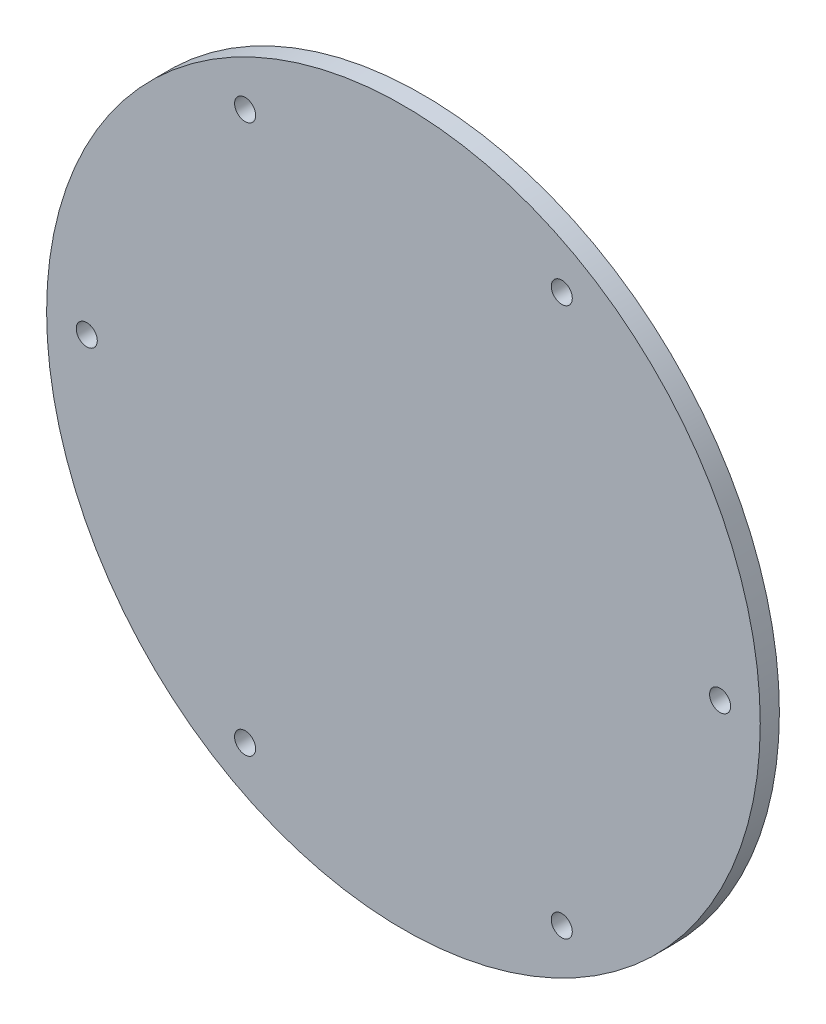
ISO-10303-21;
HEADER;
FILE_DESCRIPTION(('STEP AP214'),'2;1');
FILE_NAME('part.step','',(''),(''),'','','');
FILE_SCHEMA(('AUTOMOTIVE_DESIGN { 1 0 10303 214 1 1 1 1 }'));
ENDSEC;
DATA;
#1=APPLICATION_CONTEXT('core data for automotive mechanical design processes');
#2=APPLICATION_PROTOCOL_DEFINITION('international standard','automotive_design',2000,#1);
#3=PRODUCT_CONTEXT('',#1,'mechanical');
#4=PRODUCT('Part','Part','',(#3));
#5=PRODUCT_RELATED_PRODUCT_CATEGORY('part','',(#4));
#6=PRODUCT_DEFINITION_FORMATION('','',#4);
#7=PRODUCT_DEFINITION_CONTEXT('part definition',#1,'design');
#8=PRODUCT_DEFINITION('design','',#6,#7);
#9=PRODUCT_DEFINITION_SHAPE('','',#8);
#10=(LENGTH_UNIT() NAMED_UNIT(*) SI_UNIT(.MILLI.,.METRE.));
#11=(NAMED_UNIT(*) PLANE_ANGLE_UNIT() SI_UNIT($,.RADIAN.));
#12=(NAMED_UNIT(*) SI_UNIT($,.STERADIAN.) SOLID_ANGLE_UNIT());
#13=UNCERTAINTY_MEASURE_WITH_UNIT(LENGTH_MEASURE(1.E-05),#10,'distance_accuracy_value','');
#14=(GEOMETRIC_REPRESENTATION_CONTEXT(3) GLOBAL_UNCERTAINTY_ASSIGNED_CONTEXT((#13)) GLOBAL_UNIT_ASSIGNED_CONTEXT((#10,
#11,#12)) REPRESENTATION_CONTEXT('',''));
#15=CARTESIAN_POINT('',(0.,0.,0.));
#16=DIRECTION('',(0.,0.,1.));
#17=DIRECTION('',(1.,0.,0.));
#18=AXIS2_PLACEMENT_3D('',#15,#16,#17);
#19=CARTESIAN_POINT('',(5.51030898897942E-13,0.,3.));
#20=DIRECTION('',(0.,0.,1.));
#21=DIRECTION('',(1.,0.,0.));
#22=AXIS2_PLACEMENT_3D('',#19,#20,#21);
#23=PLANE('',#22);
#24=CARTESIAN_POINT('',(-24.8352500000004,-43.0159148186752,3.));
#25=DIRECTION('',(0.,0.,1.));
#26=DIRECTION('',(1.,0.,0.));
#27=AXIS2_PLACEMENT_3D('',#24,#25,#26);
#28=CIRCLE('',#27,1.65);
#29=CARTESIAN_POINT('',(-23.1852500000004,-43.0159148186752,3.));
#30=VERTEX_POINT('',#29);
#31=EDGE_CURVE('E82',#30,#30,#28,.T.);
#32=ORIENTED_EDGE('',*,*,#31,.F.);
#33=EDGE_LOOP('',(#32));
#34=FACE_BOUND('',#33,.T.);
#35=CARTESIAN_POINT('',(49.6705000000004,0.,3.));
#36=DIRECTION('',(0.,0.,1.));
#37=DIRECTION('',(1.,0.,0.));
#38=AXIS2_PLACEMENT_3D('',#35,#36,#37);
#39=CIRCLE('',#38,1.65);
#40=CARTESIAN_POINT('',(51.3205000000004,0.,3.));
#41=VERTEX_POINT('',#40);
#42=EDGE_CURVE('E70',#41,#41,#39,.T.);
#43=ORIENTED_EDGE('',*,*,#42,.F.);
#44=EDGE_LOOP('',(#43));
#45=FACE_BOUND('',#44,.T.);
#46=CARTESIAN_POINT('',(24.8352500000007,43.0159148186751,3.));
#47=DIRECTION('',(0.,0.,1.));
#48=DIRECTION('',(1.,0.,0.));
#49=AXIS2_PLACEMENT_3D('',#46,#47,#48);
#50=CIRCLE('',#49,1.65);
#51=CARTESIAN_POINT('',(26.4852500000007,43.0159148186751,3.));
#52=VERTEX_POINT('',#51);
#53=EDGE_CURVE('E58',#52,#52,#50,.T.);
#54=ORIENTED_EDGE('',*,*,#53,.F.);
#55=EDGE_LOOP('',(#54));
#56=FACE_BOUND('',#55,.T.);
#57=CARTESIAN_POINT('',(5.51030898897942E-13,0.,3.));
#58=DIRECTION('',(0.,0.,1.));
#59=DIRECTION('',(1.,0.,0.));
#60=AXIS2_PLACEMENT_3D('',#57,#58,#59);
#61=CIRCLE('',#60,55.9705000000003);
#62=CARTESIAN_POINT('',(55.9705000000009,0.,3.));
#63=VERTEX_POINT('',#62);
#64=EDGE_CURVE('E52',#63,#63,#61,.T.);
#65=ORIENTED_EDGE('',*,*,#64,.T.);
#66=EDGE_LOOP('',(#65));
#67=FACE_BOUND('',#66,.T.);
#68=CARTESIAN_POINT('',(-24.8352499999998,43.0159148186756,3.));
#69=DIRECTION('',(0.,0.,1.));
#70=DIRECTION('',(1.,0.,0.));
#71=AXIS2_PLACEMENT_3D('',#68,#69,#70);
#72=CIRCLE('',#71,1.65);
#73=CARTESIAN_POINT('',(-23.1852499999998,43.0159148186756,3.));
#74=VERTEX_POINT('',#73);
#75=EDGE_CURVE('E64',#74,#74,#72,.T.);
#76=ORIENTED_EDGE('',*,*,#75,.F.);
#77=EDGE_LOOP('',(#76));
#78=FACE_BOUND('',#77,.T.);
#79=CARTESIAN_POINT('',(-49.6705000000005,3.46847247682019E-13,3.));
#80=DIRECTION('',(0.,0.,1.));
#81=DIRECTION('',(1.,0.,0.));
#82=AXIS2_PLACEMENT_3D('',#79,#80,#81);
#83=CIRCLE('',#82,1.65);
#84=CARTESIAN_POINT('',(-48.0205000000005,3.46847247682019E-13,3.));
#85=VERTEX_POINT('',#84);
#86=EDGE_CURVE('E76',#85,#85,#83,.T.);
#87=ORIENTED_EDGE('',*,*,#86,.F.);
#88=EDGE_LOOP('',(#87));
#89=FACE_BOUND('',#88,.T.);
#90=CARTESIAN_POINT('',(24.8352500000001,-43.0159148186754,3.));
#91=DIRECTION('',(0.,0.,1.));
#92=DIRECTION('',(1.,0.,0.));
#93=AXIS2_PLACEMENT_3D('',#90,#91,#92);
#94=CIRCLE('',#93,1.65);
#95=CARTESIAN_POINT('',(26.4852500000001,-43.0159148186754,3.));
#96=VERTEX_POINT('',#95);
#97=EDGE_CURVE('E88',#96,#96,#94,.T.);
#98=ORIENTED_EDGE('',*,*,#97,.F.);
#99=EDGE_LOOP('',(#98));
#100=FACE_BOUND('',#99,.T.);
#101=ADVANCED_FACE('F36',(#34,#45,#56,#67,#78,#89,#100),#23,.T.);
#102=CARTESIAN_POINT('',(5.51030898897942E-13,0.,0.));
#103=DIRECTION('',(0.,0.,1.));
#104=DIRECTION('',(1.,0.,0.));
#105=AXIS2_PLACEMENT_3D('',#102,#103,#104);
#106=PLANE('',#105);
#107=CARTESIAN_POINT('',(0.,0.,0.));
#108=DIRECTION('',(0.,0.,-1.));
#109=DIRECTION('',(-1.,0.,0.));
#110=AXIS2_PLACEMENT_3D('',#107,#108,#109);
#111=CIRCLE('',#110,37.849999992);
#112=CARTESIAN_POINT('',(-37.849999992,0.,0.));
#113=VERTEX_POINT('',#112);
#114=EDGE_CURVE('E48',#113,#113,#111,.T.);
#115=ORIENTED_EDGE('',*,*,#114,.F.);
#116=EDGE_LOOP('',(#115));
#117=FACE_BOUND('',#116,.T.);
#118=CARTESIAN_POINT('',(5.51030898897942E-13,0.,0.));
#119=DIRECTION('',(0.,0.,1.));
#120=DIRECTION('',(1.,0.,0.));
#121=AXIS2_PLACEMENT_3D('',#118,#119,#120);
#122=CIRCLE('',#121,55.9705000000003);
#123=CARTESIAN_POINT('',(55.9705000000009,0.,0.));
#124=VERTEX_POINT('',#123);
#125=EDGE_CURVE('E55',#124,#124,#122,.T.);
#126=ORIENTED_EDGE('',*,*,#125,.F.);
#127=EDGE_LOOP('',(#126));
#128=FACE_BOUND('',#127,.T.);
#129=CARTESIAN_POINT('',(24.8352500000007,43.0159148186751,0.));
#130=DIRECTION('',(0.,0.,1.));
#131=DIRECTION('',(1.,0.,0.));
#132=AXIS2_PLACEMENT_3D('',#129,#130,#131);
#133=CIRCLE('',#132,1.65);
#134=CARTESIAN_POINT('',(26.4852500000007,43.0159148186751,0.));
#135=VERTEX_POINT('',#134);
#136=EDGE_CURVE('E61',#135,#135,#133,.T.);
#137=ORIENTED_EDGE('',*,*,#136,.T.);
#138=EDGE_LOOP('',(#137));
#139=FACE_BOUND('',#138,.T.);
#140=CARTESIAN_POINT('',(-24.8352499999998,43.0159148186756,0.));
#141=DIRECTION('',(0.,0.,1.));
#142=DIRECTION('',(1.,0.,0.));
#143=AXIS2_PLACEMENT_3D('',#140,#141,#142);
#144=CIRCLE('',#143,1.65);
#145=CARTESIAN_POINT('',(-23.1852499999998,43.0159148186756,0.));
#146=VERTEX_POINT('',#145);
#147=EDGE_CURVE('E67',#146,#146,#144,.T.);
#148=ORIENTED_EDGE('',*,*,#147,.T.);
#149=EDGE_LOOP('',(#148));
#150=FACE_BOUND('',#149,.T.);
#151=CARTESIAN_POINT('',(49.6705000000004,0.,0.));
#152=DIRECTION('',(0.,0.,1.));
#153=DIRECTION('',(1.,0.,0.));
#154=AXIS2_PLACEMENT_3D('',#151,#152,#153);
#155=CIRCLE('',#154,1.65);
#156=CARTESIAN_POINT('',(51.3205000000004,0.,0.));
#157=VERTEX_POINT('',#156);
#158=EDGE_CURVE('E73',#157,#157,#155,.T.);
#159=ORIENTED_EDGE('',*,*,#158,.T.);
#160=EDGE_LOOP('',(#159));
#161=FACE_BOUND('',#160,.T.);
#162=CARTESIAN_POINT('',(-49.6705000000005,3.46847247682019E-13,0.));
#163=DIRECTION('',(0.,0.,1.));
#164=DIRECTION('',(1.,0.,0.));
#165=AXIS2_PLACEMENT_3D('',#162,#163,#164);
#166=CIRCLE('',#165,1.65);
#167=CARTESIAN_POINT('',(-48.0205000000005,3.46847247682019E-13,0.));
#168=VERTEX_POINT('',#167);
#169=EDGE_CURVE('E79',#168,#168,#166,.T.);
#170=ORIENTED_EDGE('',*,*,#169,.T.);
#171=EDGE_LOOP('',(#170));
#172=FACE_BOUND('',#171,.T.);
#173=CARTESIAN_POINT('',(-24.8352500000004,-43.0159148186752,0.));
#174=DIRECTION('',(0.,0.,1.));
#175=DIRECTION('',(1.,0.,0.));
#176=AXIS2_PLACEMENT_3D('',#173,#174,#175);
#177=CIRCLE('',#176,1.65);
#178=CARTESIAN_POINT('',(-23.1852500000004,-43.0159148186752,0.));
#179=VERTEX_POINT('',#178);
#180=EDGE_CURVE('E85',#179,#179,#177,.T.);
#181=ORIENTED_EDGE('',*,*,#180,.T.);
#182=EDGE_LOOP('',(#181));
#183=FACE_BOUND('',#182,.T.);
#184=CARTESIAN_POINT('',(24.8352500000001,-43.0159148186754,0.));
#185=DIRECTION('',(0.,0.,1.));
#186=DIRECTION('',(1.,0.,0.));
#187=AXIS2_PLACEMENT_3D('',#184,#185,#186);
#188=CIRCLE('',#187,1.65);
#189=CARTESIAN_POINT('',(26.4852500000001,-43.0159148186754,0.));
#190=VERTEX_POINT('',#189);
#191=EDGE_CURVE('E91',#190,#190,#188,.T.);
#192=ORIENTED_EDGE('',*,*,#191,.T.);
#193=EDGE_LOOP('',(#192));
#194=FACE_BOUND('',#193,.T.);
#195=ADVANCED_FACE('F101',(#117,#128,#139,#150,#161,#172,#183,#194),#106,.F.);
#196=CARTESIAN_POINT('',(5.51030898897942E-13,0.,3.));
#197=DIRECTION('',(0.,0.,-1.));
#198=DIRECTION('',(-1.,0.,0.));
#199=AXIS2_PLACEMENT_3D('',#196,#197,#198);
#200=CYLINDRICAL_SURFACE('',#199,55.9705000000003);
#201=ORIENTED_EDGE('',*,*,#64,.F.);
#202=EDGE_LOOP('',(#201));
#203=FACE_BOUND('',#202,.T.);
#204=ORIENTED_EDGE('',*,*,#125,.T.);
#205=EDGE_LOOP('',(#204));
#206=FACE_BOUND('',#205,.T.);
#207=ADVANCED_FACE('F107',(#203,#206),#200,.T.);
#208=CARTESIAN_POINT('',(24.8352500000007,43.0159148186751,3.));
#209=DIRECTION('',(0.,0.,-1.));
#210=DIRECTION('',(-1.,0.,0.));
#211=AXIS2_PLACEMENT_3D('',#208,#209,#210);
#212=CYLINDRICAL_SURFACE('',#211,1.65);
#213=ORIENTED_EDGE('',*,*,#53,.T.);
#214=EDGE_LOOP('',(#213));
#215=FACE_BOUND('',#214,.T.);
#216=ORIENTED_EDGE('',*,*,#136,.F.);
#217=EDGE_LOOP('',(#216));
#218=FACE_BOUND('',#217,.T.);
#219=ADVANCED_FACE('F113',(#215,#218),#212,.F.);
#220=CARTESIAN_POINT('',(-24.8352499999998,43.0159148186756,3.));
#221=DIRECTION('',(0.,0.,-1.));
#222=DIRECTION('',(-1.,0.,0.));
#223=AXIS2_PLACEMENT_3D('',#220,#221,#222);
#224=CYLINDRICAL_SURFACE('',#223,1.65);
#225=ORIENTED_EDGE('',*,*,#75,.T.);
#226=EDGE_LOOP('',(#225));
#227=FACE_BOUND('',#226,.T.);
#228=ORIENTED_EDGE('',*,*,#147,.F.);
#229=EDGE_LOOP('',(#228));
#230=FACE_BOUND('',#229,.T.);
#231=ADVANCED_FACE('F120',(#227,#230),#224,.F.);
#232=CARTESIAN_POINT('',(49.6705000000004,0.,3.));
#233=DIRECTION('',(0.,0.,-1.));
#234=DIRECTION('',(-1.,0.,0.));
#235=AXIS2_PLACEMENT_3D('',#232,#233,#234);
#236=CYLINDRICAL_SURFACE('',#235,1.65);
#237=ORIENTED_EDGE('',*,*,#42,.T.);
#238=EDGE_LOOP('',(#237));
#239=FACE_BOUND('',#238,.T.);
#240=ORIENTED_EDGE('',*,*,#158,.F.);
#241=EDGE_LOOP('',(#240));
#242=FACE_BOUND('',#241,.T.);
#243=ADVANCED_FACE('F155',(#239,#242),#236,.F.);
#244=CARTESIAN_POINT('',(-49.6705000000005,3.46847247682019E-13,3.));
#245=DIRECTION('',(0.,0.,-1.));
#246=DIRECTION('',(-1.,0.,0.));
#247=AXIS2_PLACEMENT_3D('',#244,#245,#246);
#248=CYLINDRICAL_SURFACE('',#247,1.65);
#249=ORIENTED_EDGE('',*,*,#86,.T.);
#250=EDGE_LOOP('',(#249));
#251=FACE_BOUND('',#250,.T.);
#252=ORIENTED_EDGE('',*,*,#169,.F.);
#253=EDGE_LOOP('',(#252));
#254=FACE_BOUND('',#253,.T.);
#255=ADVANCED_FACE('F148',(#251,#254),#248,.F.);
#256=CARTESIAN_POINT('',(-24.8352500000004,-43.0159148186752,3.));
#257=DIRECTION('',(0.,0.,-1.));
#258=DIRECTION('',(-1.,0.,0.));
#259=AXIS2_PLACEMENT_3D('',#256,#257,#258);
#260=CYLINDRICAL_SURFACE('',#259,1.65);
#261=ORIENTED_EDGE('',*,*,#31,.T.);
#262=EDGE_LOOP('',(#261));
#263=FACE_BOUND('',#262,.T.);
#264=ORIENTED_EDGE('',*,*,#180,.F.);
#265=EDGE_LOOP('',(#264));
#266=FACE_BOUND('',#265,.T.);
#267=ADVANCED_FACE('F140',(#263,#266),#260,.F.);
#268=CARTESIAN_POINT('',(24.8352500000001,-43.0159148186754,3.));
#269=DIRECTION('',(0.,0.,-1.));
#270=DIRECTION('',(-1.,0.,0.));
#271=AXIS2_PLACEMENT_3D('',#268,#269,#270);
#272=CYLINDRICAL_SURFACE('',#271,1.65);
#273=ORIENTED_EDGE('',*,*,#97,.T.);
#274=EDGE_LOOP('',(#273));
#275=FACE_BOUND('',#274,.T.);
#276=ORIENTED_EDGE('',*,*,#191,.F.);
#277=EDGE_LOOP('',(#276));
#278=FACE_BOUND('',#277,.T.);
#279=ADVANCED_FACE('F97',(#275,#278),#272,.F.);
#280=CARTESIAN_POINT('',(0.,0.,0.));
#281=DIRECTION('',(0.,0.,1.));
#282=DIRECTION('',(-1.,0.,0.));
#283=AXIS2_PLACEMENT_3D('',#280,#281,#282);
#284=CONICAL_SURFACE('',#283,37.849999992,0.0349065850398867);
#285=CARTESIAN_POINT('',(0.,0.,-1.50030458649046));
#286=DIRECTION('',(0.,0.,1.));
#287=DIRECTION('',(1.,0.,0.));
#288=AXIS2_PLACEMENT_3D('',#285,#286,#287);
#289=CIRCLE('',#288,37.7976082013678);
#290=CARTESIAN_POINT('',(37.7976082013678,0.,-1.50030458649046));
#291=VERTEX_POINT('',#290);
#292=EDGE_CURVE('E10',#291,#291,#289,.T.);
#293=ORIENTED_EDGE('',*,*,#292,.T.);
#294=EDGE_LOOP('',(#293));
#295=FACE_BOUND('',#294,.T.);
#296=ORIENTED_EDGE('',*,*,#114,.T.);
#297=EDGE_LOOP('',(#296));
#298=FACE_BOUND('',#297,.T.);
#299=ADVANCED_FACE('F139',(#295,#298),#284,.T.);
#300=CARTESIAN_POINT('',(0.,0.,-2.));
#301=DIRECTION('',(0.,0.,-1.));
#302=DIRECTION('',(-1.,0.,0.));
#303=AXIS2_PLACEMENT_3D('',#300,#301,#302);
#304=PLANE('',#303);
#305=CARTESIAN_POINT('',(0.,0.,-2.));
#306=DIRECTION('',(0.,0.,-1.));
#307=DIRECTION('',(-1.,0.,0.));
#308=AXIS2_PLACEMENT_3D('',#305,#306,#307);
#309=CIRCLE('',#308,37.2617504753773);
#310=CARTESIAN_POINT('',(-37.2617504753773,0.,-2.));
#311=VERTEX_POINT('',#310);
#312=EDGE_CURVE('E44',#311,#311,#309,.T.);
#313=ORIENTED_EDGE('',*,*,#312,.T.);
#314=EDGE_LOOP('',(#313));
#315=FACE_BOUND('',#314,.T.);
#316=ADVANCED_FACE('F146',(#315),#304,.T.);
#317=CARTESIAN_POINT('',(0.,0.,-2.));
#318=DIRECTION('',(0.,0.,1.));
#319=DIRECTION('',(1.,0.,0.));
#320=AXIS2_PLACEMENT_3D('',#317,#318,#319);
#321=CONICAL_SURFACE('',#320,37.2617504753773,0.820304748437332);
#322=ORIENTED_EDGE('',*,*,#292,.F.);
#323=EDGE_LOOP('',(#322));
#324=FACE_BOUND('',#323,.T.);
#325=ORIENTED_EDGE('',*,*,#312,.F.);
#326=EDGE_LOOP('',(#325));
#327=FACE_BOUND('',#326,.T.);
#328=ADVANCED_FACE('F39',(#324,#327),#321,.T.);
#329=CLOSED_SHELL('',(#101,#195,#207,#219,#231,#243,#255,#267,#279,#299,#316,#328));
#330=MANIFOLD_SOLID_BREP('B2',#329);
#331=ADVANCED_BREP_SHAPE_REPRESENTATION('',(#18,#330),#14);
#332=SHAPE_DEFINITION_REPRESENTATION(#9,#331);
ENDSEC;
END-ISO-10303-21;
